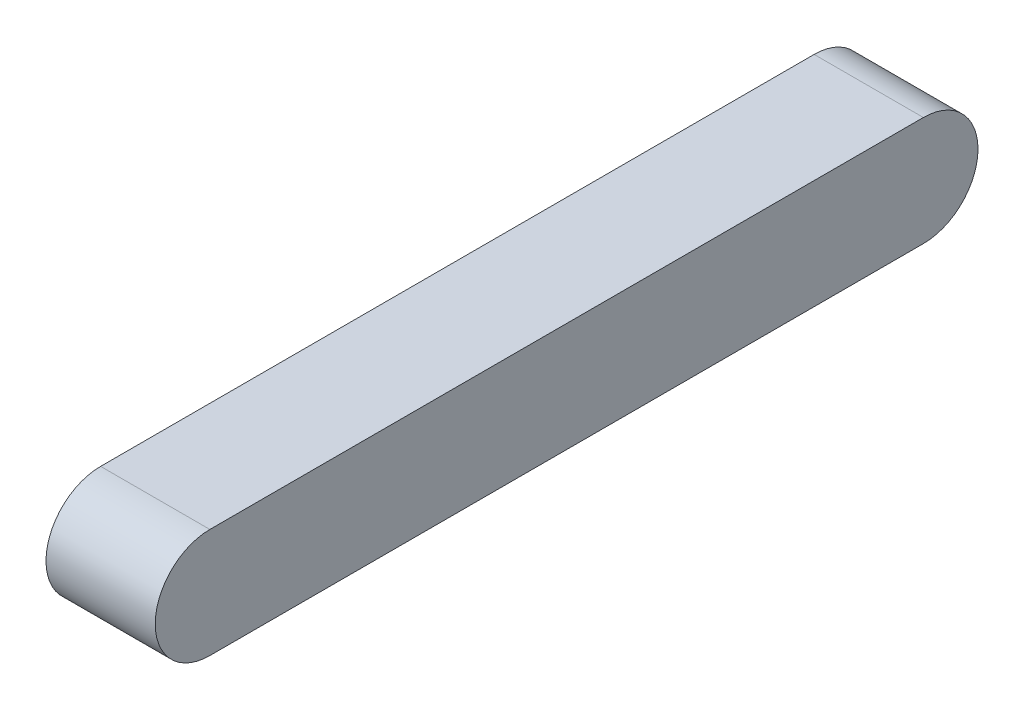
ISO-10303-21;
HEADER;
FILE_DESCRIPTION(('STEP AP214'),'2;1');
FILE_NAME('part.step','',(''),(''),'','','');
FILE_SCHEMA(('AUTOMOTIVE_DESIGN { 1 0 10303 214 1 1 1 1 }'));
ENDSEC;
DATA;
#1=APPLICATION_CONTEXT('core data for automotive mechanical design processes');
#2=APPLICATION_PROTOCOL_DEFINITION('international standard','automotive_design',2000,#1);
#3=PRODUCT_CONTEXT('',#1,'mechanical');
#4=PRODUCT('Part','Part','',(#3));
#5=PRODUCT_RELATED_PRODUCT_CATEGORY('part','',(#4));
#6=PRODUCT_DEFINITION_FORMATION('','',#4);
#7=PRODUCT_DEFINITION_CONTEXT('part definition',#1,'design');
#8=PRODUCT_DEFINITION('design','',#6,#7);
#9=PRODUCT_DEFINITION_SHAPE('','',#8);
#10=(LENGTH_UNIT() NAMED_UNIT(*) SI_UNIT(.MILLI.,.METRE.));
#11=(NAMED_UNIT(*) PLANE_ANGLE_UNIT() SI_UNIT($,.RADIAN.));
#12=(NAMED_UNIT(*) SI_UNIT($,.STERADIAN.) SOLID_ANGLE_UNIT());
#13=UNCERTAINTY_MEASURE_WITH_UNIT(LENGTH_MEASURE(1.E-05),#10,'distance_accuracy_value','');
#14=(GEOMETRIC_REPRESENTATION_CONTEXT(3) GLOBAL_UNCERTAINTY_ASSIGNED_CONTEXT((#13)) GLOBAL_UNIT_ASSIGNED_CONTEXT((#10,
#11,#12)) REPRESENTATION_CONTEXT('',''));
#15=CARTESIAN_POINT('',(0.,0.,0.));
#16=DIRECTION('',(0.,0.,1.));
#17=DIRECTION('',(1.,0.,0.));
#18=AXIS2_PLACEMENT_3D('',#15,#16,#17);
#19=CARTESIAN_POINT('',(2.39,0.,2.39));
#20=DIRECTION('',(1.,0.,0.));
#21=DIRECTION('',(0.,0.,-1.));
#22=AXIS2_PLACEMENT_3D('',#19,#20,#21);
#23=CYLINDRICAL_SURFACE('',#22,2.39);
#24=DIRECTION('',(-1.,0.,0.));
#25=VECTOR('',#24,1.);
#26=CARTESIAN_POINT('',(2.39,2.39,2.39));
#27=LINE('',#26,#25);
#28=CARTESIAN_POINT('',(2.39,2.39,2.39));
#29=VERTEX_POINT('',#28);
#30=CARTESIAN_POINT('',(-2.39,2.39,2.39));
#31=VERTEX_POINT('',#30);
#32=EDGE_CURVE('E95',#29,#31,#27,.T.);
#33=ORIENTED_EDGE('',*,*,#32,.F.);
#34=CARTESIAN_POINT('',(2.39,0.,2.39));
#35=DIRECTION('',(1.,0.,0.));
#36=DIRECTION('',(0.,1.,0.));
#37=AXIS2_PLACEMENT_3D('',#34,#35,#36);
#38=CIRCLE('',#37,2.39);
#39=CARTESIAN_POINT('',(2.39,-2.39,2.39));
#40=VERTEX_POINT('',#39);
#41=EDGE_CURVE('E45',#40,#29,#38,.T.);
#42=ORIENTED_EDGE('',*,*,#41,.F.);
#43=DIRECTION('',(1.,0.,0.));
#44=VECTOR('',#43,1.);
#45=CARTESIAN_POINT('',(-2.39,-2.39,2.39));
#46=LINE('',#45,#44);
#47=CARTESIAN_POINT('',(-2.39,-2.39,2.39));
#48=VERTEX_POINT('',#47);
#49=EDGE_CURVE('E107',#48,#40,#46,.T.);
#50=ORIENTED_EDGE('',*,*,#49,.F.);
#51=CARTESIAN_POINT('',(-2.39,0.,2.39));
#52=DIRECTION('',(1.,0.,0.));
#53=DIRECTION('',(0.,1.,0.));
#54=AXIS2_PLACEMENT_3D('',#51,#52,#53);
#55=CIRCLE('',#54,2.39);
#56=EDGE_CURVE('E11',#31,#48,#55,.F.);
#57=ORIENTED_EDGE('',*,*,#56,.F.);
#58=EDGE_LOOP('',(#33,#42,#50,#57));
#59=FACE_BOUND('',#58,.T.);
#60=ADVANCED_FACE('F37',(#59),#23,.T.);
#61=CARTESIAN_POINT('',(-2.39,0.,33.61));
#62=DIRECTION('',(1.,0.,0.));
#63=DIRECTION('',(0.,0.,-1.));
#64=AXIS2_PLACEMENT_3D('',#61,#62,#63);
#65=CYLINDRICAL_SURFACE('',#64,2.39);
#66=DIRECTION('',(1.,0.,0.));
#67=VECTOR('',#66,1.);
#68=CARTESIAN_POINT('',(-2.39,2.39,33.61));
#69=LINE('',#68,#67);
#70=CARTESIAN_POINT('',(-2.39,2.39,33.61));
#71=VERTEX_POINT('',#70);
#72=CARTESIAN_POINT('',(2.39,2.39,33.61));
#73=VERTEX_POINT('',#72);
#74=EDGE_CURVE('E87',#71,#73,#69,.T.);
#75=ORIENTED_EDGE('',*,*,#74,.F.);
#76=CARTESIAN_POINT('',(-2.39,0.,33.61));
#77=DIRECTION('',(1.,0.,0.));
#78=DIRECTION('',(0.,1.,0.));
#79=AXIS2_PLACEMENT_3D('',#76,#77,#78);
#80=CIRCLE('',#79,2.39);
#81=CARTESIAN_POINT('',(-2.39,-2.39,33.61));
#82=VERTEX_POINT('',#81);
#83=EDGE_CURVE('E73',#82,#71,#80,.F.);
#84=ORIENTED_EDGE('',*,*,#83,.F.);
#85=DIRECTION('',(-1.,0.,0.));
#86=VECTOR('',#85,1.);
#87=CARTESIAN_POINT('',(-2.39,-2.39,33.61));
#88=LINE('',#87,#86);
#89=CARTESIAN_POINT('',(2.39,-2.39,33.61));
#90=VERTEX_POINT('',#89);
#91=EDGE_CURVE('E84',#90,#82,#88,.T.);
#92=ORIENTED_EDGE('',*,*,#91,.F.);
#93=CARTESIAN_POINT('',(2.39,0.,33.61));
#94=DIRECTION('',(1.,0.,0.));
#95=DIRECTION('',(0.,1.,0.));
#96=AXIS2_PLACEMENT_3D('',#93,#94,#95);
#97=CIRCLE('',#96,2.39);
#98=EDGE_CURVE('E83',#73,#90,#97,.T.);
#99=ORIENTED_EDGE('',*,*,#98,.F.);
#100=EDGE_LOOP('',(#75,#84,#92,#99));
#101=FACE_BOUND('',#100,.T.);
#102=ADVANCED_FACE('F88',(#101),#65,.T.);
#103=CARTESIAN_POINT('',(-2.39,2.39,36.));
#104=DIRECTION('',(1.,0.,0.));
#105=DIRECTION('',(0.,1.,0.));
#106=AXIS2_PLACEMENT_3D('',#103,#104,#105);
#107=PLANE('',#106);
#108=DIRECTION('',(0.,0.,-1.));
#109=VECTOR('',#108,1.);
#110=CARTESIAN_POINT('',(-2.39,2.39,36.));
#111=LINE('',#110,#109);
#112=EDGE_CURVE('E77',#71,#31,#111,.T.);
#113=ORIENTED_EDGE('',*,*,#112,.T.);
#114=ORIENTED_EDGE('',*,*,#56,.T.);
#115=DIRECTION('',(0.,0.,-1.));
#116=VECTOR('',#115,1.);
#117=CARTESIAN_POINT('',(-2.39,-2.39,36.));
#118=LINE('',#117,#116);
#119=EDGE_CURVE('E79',#82,#48,#118,.T.);
#120=ORIENTED_EDGE('',*,*,#119,.F.);
#121=ORIENTED_EDGE('',*,*,#83,.T.);
#122=EDGE_LOOP('',(#113,#114,#120,#121));
#123=FACE_BOUND('',#122,.T.);
#124=ADVANCED_FACE('F75',(#123),#107,.F.);
#125=CARTESIAN_POINT('',(-2.39,-2.39,36.));
#126=DIRECTION('',(0.,1.,0.));
#127=DIRECTION('',(0.,0.,1.));
#128=AXIS2_PLACEMENT_3D('',#125,#126,#127);
#129=PLANE('',#128);
#130=ORIENTED_EDGE('',*,*,#119,.T.);
#131=ORIENTED_EDGE('',*,*,#49,.T.);
#132=DIRECTION('',(0.,0.,-1.));
#133=VECTOR('',#132,1.);
#134=CARTESIAN_POINT('',(2.39,-2.39,36.));
#135=LINE('',#134,#133);
#136=EDGE_CURVE('E98',#90,#40,#135,.T.);
#137=ORIENTED_EDGE('',*,*,#136,.F.);
#138=ORIENTED_EDGE('',*,*,#91,.T.);
#139=EDGE_LOOP('',(#130,#131,#137,#138));
#140=FACE_BOUND('',#139,.T.);
#141=ADVANCED_FACE('F112',(#140),#129,.F.);
#142=CARTESIAN_POINT('',(2.39,2.39,36.));
#143=DIRECTION('',(1.,0.,0.));
#144=DIRECTION('',(0.,1.,0.));
#145=AXIS2_PLACEMENT_3D('',#142,#143,#144);
#146=PLANE('',#145);
#147=ORIENTED_EDGE('',*,*,#136,.T.);
#148=ORIENTED_EDGE('',*,*,#41,.T.);
#149=DIRECTION('',(0.,0.,-1.));
#150=VECTOR('',#149,1.);
#151=CARTESIAN_POINT('',(2.39,2.39,36.));
#152=LINE('',#151,#150);
#153=EDGE_CURVE('E96',#73,#29,#152,.T.);
#154=ORIENTED_EDGE('',*,*,#153,.F.);
#155=ORIENTED_EDGE('',*,*,#98,.T.);
#156=EDGE_LOOP('',(#147,#148,#154,#155));
#157=FACE_BOUND('',#156,.T.);
#158=ADVANCED_FACE('F109',(#157),#146,.T.);
#159=CARTESIAN_POINT('',(-2.39,2.39,36.));
#160=DIRECTION('',(0.,1.,0.));
#161=DIRECTION('',(0.,0.,1.));
#162=AXIS2_PLACEMENT_3D('',#159,#160,#161);
#163=PLANE('',#162);
#164=ORIENTED_EDGE('',*,*,#153,.T.);
#165=ORIENTED_EDGE('',*,*,#32,.T.);
#166=ORIENTED_EDGE('',*,*,#112,.F.);
#167=ORIENTED_EDGE('',*,*,#74,.T.);
#168=EDGE_LOOP('',(#164,#165,#166,#167));
#169=FACE_BOUND('',#168,.T.);
#170=ADVANCED_FACE('F94',(#169),#163,.T.);
#171=CLOSED_SHELL('',(#60,#102,#124,#141,#158,#170));
#172=MANIFOLD_SOLID_BREP('B2',#171);
#173=ADVANCED_BREP_SHAPE_REPRESENTATION('',(#18,#172),#14);
#174=SHAPE_DEFINITION_REPRESENTATION(#9,#173);
ENDSEC;
END-ISO-10303-21;
